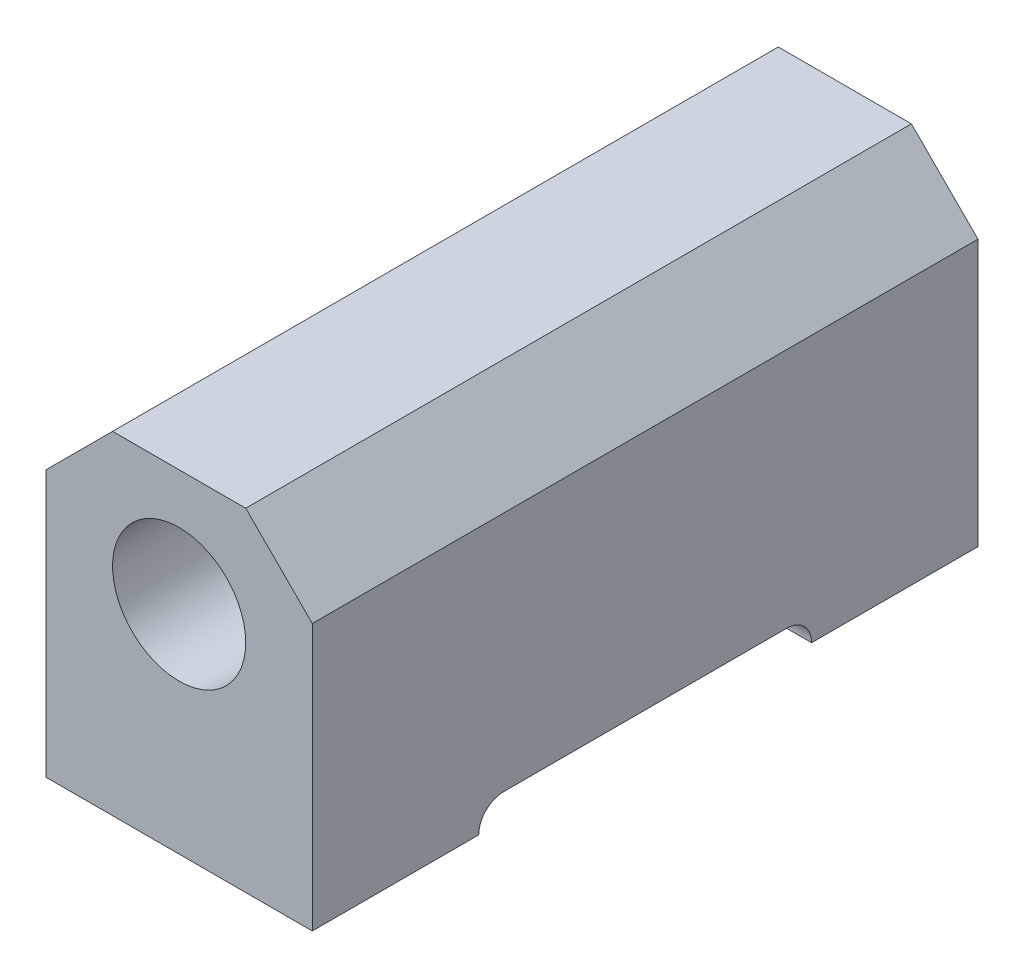
ISO-10303-21;
HEADER;
FILE_DESCRIPTION(('STEP AP214'),'2;1');
FILE_NAME('part.step','',(''),(''),'','','');
FILE_SCHEMA(('AUTOMOTIVE_DESIGN { 1 0 10303 214 1 1 1 1 }'));
ENDSEC;
DATA;
#1=APPLICATION_CONTEXT('core data for automotive mechanical design processes');
#2=APPLICATION_PROTOCOL_DEFINITION('international standard','automotive_design',2000,#1);
#3=PRODUCT_CONTEXT('',#1,'mechanical');
#4=PRODUCT('Part','Part','',(#3));
#5=PRODUCT_RELATED_PRODUCT_CATEGORY('part','',(#4));
#6=PRODUCT_DEFINITION_FORMATION('','',#4);
#7=PRODUCT_DEFINITION_CONTEXT('part definition',#1,'design');
#8=PRODUCT_DEFINITION('design','',#6,#7);
#9=PRODUCT_DEFINITION_SHAPE('','',#8);
#10=(LENGTH_UNIT() NAMED_UNIT(*) SI_UNIT(.MILLI.,.METRE.));
#11=(NAMED_UNIT(*) PLANE_ANGLE_UNIT() SI_UNIT($,.RADIAN.));
#12=(NAMED_UNIT(*) SI_UNIT($,.STERADIAN.) SOLID_ANGLE_UNIT());
#13=UNCERTAINTY_MEASURE_WITH_UNIT(LENGTH_MEASURE(1.E-05),#10,'distance_accuracy_value','');
#14=(GEOMETRIC_REPRESENTATION_CONTEXT(3) GLOBAL_UNCERTAINTY_ASSIGNED_CONTEXT((#13)) GLOBAL_UNIT_ASSIGNED_CONTEXT((#10,
#11,#12)) REPRESENTATION_CONTEXT('',''));
#15=CARTESIAN_POINT('',(0.,0.,0.));
#16=DIRECTION('',(0.,0.,1.));
#17=DIRECTION('',(1.,0.,0.));
#18=AXIS2_PLACEMENT_3D('',#15,#16,#17);
#19=CARTESIAN_POINT('',(-16.,0.,80.));
#20=DIRECTION('',(0.,1.,0.));
#21=DIRECTION('',(0.,0.,1.));
#22=AXIS2_PLACEMENT_3D('',#19,#20,#21);
#23=PLANE('',#22);
#24=DIRECTION('',(0.,0.,-1.));
#25=VECTOR('',#24,1.);
#26=CARTESIAN_POINT('',(-16.,0.,80.));
#27=LINE('',#26,#25);
#28=CARTESIAN_POINT('',(-16.,0.,80.));
#29=VERTEX_POINT('',#28);
#30=CARTESIAN_POINT('',(-16.,0.,60.));
#31=VERTEX_POINT('',#30);
#32=EDGE_CURVE('E11',#29,#31,#27,.T.);
#33=ORIENTED_EDGE('',*,*,#32,.T.);
#34=DIRECTION('',(1.,0.,0.));
#35=VECTOR('',#34,1.);
#36=CARTESIAN_POINT('',(-16.,0.,60.));
#37=LINE('',#36,#35);
#38=CARTESIAN_POINT('',(16.,0.,60.));
#39=VERTEX_POINT('',#38);
#40=EDGE_CURVE('E149',#31,#39,#37,.T.);
#41=ORIENTED_EDGE('',*,*,#40,.T.);
#42=DIRECTION('',(0.,0.,-1.));
#43=VECTOR('',#42,1.);
#44=CARTESIAN_POINT('',(16.,0.,80.));
#45=LINE('',#44,#43);
#46=CARTESIAN_POINT('',(16.,0.,80.));
#47=VERTEX_POINT('',#46);
#48=EDGE_CURVE('E196',#47,#39,#45,.T.);
#49=ORIENTED_EDGE('',*,*,#48,.F.);
#50=DIRECTION('',(1.,0.,0.));
#51=VECTOR('',#50,1.);
#52=CARTESIAN_POINT('',(-16.,0.,80.));
#53=LINE('',#52,#51);
#54=EDGE_CURVE('E161',#29,#47,#53,.T.);
#55=ORIENTED_EDGE('',*,*,#54,.F.);
#56=EDGE_LOOP('',(#33,#41,#49,#55));
#57=FACE_BOUND('',#56,.T.);
#58=ADVANCED_FACE('F35',(#57),#23,.F.);
#59=CARTESIAN_POINT('',(-16.,32.,80.));
#60=DIRECTION('',(1.,0.,0.));
#61=DIRECTION('',(0.,0.,-1.));
#62=AXIS2_PLACEMENT_3D('',#59,#60,#61);
#63=PLANE('',#62);
#64=DIRECTION('',(0.,0.,1.));
#65=VECTOR('',#64,1.);
#66=CARTESIAN_POINT('',(-16.,3.,57.));
#67=LINE('',#66,#65);
#68=CARTESIAN_POINT('',(-16.,3.,23.));
#69=VERTEX_POINT('',#68);
#70=CARTESIAN_POINT('',(-16.,3.,57.));
#71=VERTEX_POINT('',#70);
#72=EDGE_CURVE('E139',#69,#71,#67,.T.);
#73=ORIENTED_EDGE('',*,*,#72,.T.);
#74=CARTESIAN_POINT('',(-16.,0.,57.));
#75=DIRECTION('',(1.,0.,0.));
#76=DIRECTION('',(0.,0.,1.));
#77=AXIS2_PLACEMENT_3D('',#74,#75,#76);
#78=CIRCLE('',#77,3.);
#79=EDGE_CURVE('E143',#71,#31,#78,.T.);
#80=ORIENTED_EDGE('',*,*,#79,.T.);
#81=ORIENTED_EDGE('',*,*,#32,.F.);
#82=DIRECTION('',(0.,-1.,0.));
#83=VECTOR('',#82,1.);
#84=CARTESIAN_POINT('',(-16.,32.,80.));
#85=LINE('',#84,#83);
#86=CARTESIAN_POINT('',(-16.,32.,80.));
#87=VERTEX_POINT('',#86);
#88=EDGE_CURVE('E158',#87,#29,#85,.T.);
#89=ORIENTED_EDGE('',*,*,#88,.F.);
#90=DIRECTION('',(0.,0.,-1.));
#91=VECTOR('',#90,1.);
#92=CARTESIAN_POINT('',(-16.,32.,80.));
#93=LINE('',#92,#91);
#94=CARTESIAN_POINT('',(-16.,32.,0.));
#95=VERTEX_POINT('',#94);
#96=EDGE_CURVE('E172',#87,#95,#93,.T.);
#97=ORIENTED_EDGE('',*,*,#96,.T.);
#98=DIRECTION('',(0.,-1.,0.));
#99=VECTOR('',#98,1.);
#100=CARTESIAN_POINT('',(-16.,32.,0.));
#101=LINE('',#100,#99);
#102=CARTESIAN_POINT('',(-16.,0.,0.));
#103=VERTEX_POINT('',#102);
#104=EDGE_CURVE('E152',#95,#103,#101,.T.);
#105=ORIENTED_EDGE('',*,*,#104,.T.);
#106=CARTESIAN_POINT('',(-16.,0.,20.));
#107=VERTEX_POINT('',#106);
#108=EDGE_CURVE('E43',#107,#103,#27,.T.);
#109=ORIENTED_EDGE('',*,*,#108,.F.);
#110=CARTESIAN_POINT('',(-16.,0.,23.));
#111=DIRECTION('',(1.,0.,0.));
#112=DIRECTION('',(0.,0.,-1.));
#113=AXIS2_PLACEMENT_3D('',#110,#111,#112);
#114=CIRCLE('',#113,3.);
#115=EDGE_CURVE('E136',#107,#69,#114,.T.);
#116=ORIENTED_EDGE('',*,*,#115,.T.);
#117=EDGE_LOOP('',(#73,#80,#81,#89,#97,#105,#109,#116));
#118=FACE_BOUND('',#117,.T.);
#119=ADVANCED_FACE('F37',(#118),#63,.F.);
#120=CARTESIAN_POINT('',(0.,0.,10.));
#121=DIRECTION('',(0.,-1.,0.));
#122=DIRECTION('',(0.,0.,-1.));
#123=AXIS2_PLACEMENT_3D('',#120,#121,#122);
#124=CIRCLE('',#123,2.);
#125=CARTESIAN_POINT('',(0.,0.,8.));
#126=VERTEX_POINT('',#125);
#127=EDGE_CURVE('E259',#126,#126,#124,.T.);
#128=ORIENTED_EDGE('',*,*,#127,.F.);
#129=EDGE_LOOP('',(#128));
#130=FACE_BOUND('',#129,.T.);
#131=CARTESIAN_POINT('',(16.,0.,20.));
#132=VERTEX_POINT('',#131);
#133=CARTESIAN_POINT('',(16.,0.,0.));
#134=VERTEX_POINT('',#133);
#135=EDGE_CURVE('E195',#132,#134,#45,.T.);
#136=ORIENTED_EDGE('',*,*,#135,.F.);
#137=DIRECTION('',(1.,0.,0.));
#138=VECTOR('',#137,1.);
#139=CARTESIAN_POINT('',(-16.,0.,20.));
#140=LINE('',#139,#138);
#141=EDGE_CURVE('E55',#107,#132,#140,.T.);
#142=ORIENTED_EDGE('',*,*,#141,.F.);
#143=ORIENTED_EDGE('',*,*,#108,.T.);
#144=DIRECTION('',(1.,0.,0.));
#145=VECTOR('',#144,1.);
#146=CARTESIAN_POINT('',(-16.,0.,0.));
#147=LINE('',#146,#145);
#148=EDGE_CURVE('E175',#103,#134,#147,.T.);
#149=ORIENTED_EDGE('',*,*,#148,.T.);
#150=EDGE_LOOP('',(#136,#142,#143,#149));
#151=FACE_BOUND('',#150,.T.);
#152=ADVANCED_FACE('F209',(#130,#151),#23,.F.);
#153=CARTESIAN_POINT('',(16.,0.,80.));
#154=DIRECTION('',(-1.,0.,0.));
#155=DIRECTION('',(0.,0.,1.));
#156=AXIS2_PLACEMENT_3D('',#153,#154,#155);
#157=PLANE('',#156);
#158=ORIENTED_EDGE('',*,*,#48,.T.);
#159=CARTESIAN_POINT('',(16.,0.,57.));
#160=DIRECTION('',(1.,0.,0.));
#161=DIRECTION('',(0.,0.,1.));
#162=AXIS2_PLACEMENT_3D('',#159,#160,#161);
#163=CIRCLE('',#162,3.);
#164=CARTESIAN_POINT('',(16.,3.,57.));
#165=VERTEX_POINT('',#164);
#166=EDGE_CURVE('E140',#165,#39,#163,.T.);
#167=ORIENTED_EDGE('',*,*,#166,.F.);
#168=DIRECTION('',(0.,0.,1.));
#169=VECTOR('',#168,1.);
#170=CARTESIAN_POINT('',(16.,3.,57.));
#171=LINE('',#170,#169);
#172=CARTESIAN_POINT('',(16.,3.,23.));
#173=VERTEX_POINT('',#172);
#174=EDGE_CURVE('E129',#173,#165,#171,.T.);
#175=ORIENTED_EDGE('',*,*,#174,.F.);
#176=CARTESIAN_POINT('',(16.,0.,23.));
#177=DIRECTION('',(1.,0.,0.));
#178=DIRECTION('',(0.,0.,-1.));
#179=AXIS2_PLACEMENT_3D('',#176,#177,#178);
#180=CIRCLE('',#179,3.);
#181=EDGE_CURVE('E126',#132,#173,#180,.T.);
#182=ORIENTED_EDGE('',*,*,#181,.F.);
#183=ORIENTED_EDGE('',*,*,#135,.T.);
#184=DIRECTION('',(0.,1.,0.));
#185=VECTOR('',#184,1.);
#186=CARTESIAN_POINT('',(16.,0.,0.));
#187=LINE('',#186,#185);
#188=CARTESIAN_POINT('',(16.,32.,0.));
#189=VERTEX_POINT('',#188);
#190=EDGE_CURVE('E178',#134,#189,#187,.T.);
#191=ORIENTED_EDGE('',*,*,#190,.T.);
#192=DIRECTION('',(0.,0.,-1.));
#193=VECTOR('',#192,1.);
#194=CARTESIAN_POINT('',(16.,32.,80.));
#195=LINE('',#194,#193);
#196=CARTESIAN_POINT('',(16.,32.,80.));
#197=VERTEX_POINT('',#196);
#198=EDGE_CURVE('E193',#197,#189,#195,.T.);
#199=ORIENTED_EDGE('',*,*,#198,.F.);
#200=DIRECTION('',(0.,1.,0.));
#201=VECTOR('',#200,1.);
#202=CARTESIAN_POINT('',(16.,0.,80.));
#203=LINE('',#202,#201);
#204=EDGE_CURVE('E164',#47,#197,#203,.T.);
#205=ORIENTED_EDGE('',*,*,#204,.F.);
#206=EDGE_LOOP('',(#158,#167,#175,#182,#183,#191,#199,#205));
#207=FACE_BOUND('',#206,.T.);
#208=ADVANCED_FACE('F203',(#207),#157,.F.);
#209=CARTESIAN_POINT('',(16.,32.,80.));
#210=DIRECTION('',(-0.707106781186549,-0.707106781186546,0.));
#211=DIRECTION('',(0.707106781186546,-0.707106781186549,0.));
#212=AXIS2_PLACEMENT_3D('',#209,#210,#211);
#213=PLANE('',#212);
#214=DIRECTION('',(-0.707106781186546,0.707106781186549,0.));
#215=VECTOR('',#214,1.);
#216=CARTESIAN_POINT('',(16.,32.,0.));
#217=LINE('',#216,#215);
#218=CARTESIAN_POINT('',(8.00000000000003,40.,0.));
#219=VERTEX_POINT('',#218);
#220=EDGE_CURVE('E180',#189,#219,#217,.T.);
#221=ORIENTED_EDGE('',*,*,#220,.T.);
#222=DIRECTION('',(0.,0.,-1.));
#223=VECTOR('',#222,1.);
#224=CARTESIAN_POINT('',(8.00000000000003,40.,80.));
#225=LINE('',#224,#223);
#226=CARTESIAN_POINT('',(8.00000000000003,40.,80.));
#227=VERTEX_POINT('',#226);
#228=EDGE_CURVE('E190',#227,#219,#225,.T.);
#229=ORIENTED_EDGE('',*,*,#228,.F.);
#230=DIRECTION('',(-0.707106781186546,0.707106781186549,0.));
#231=VECTOR('',#230,1.);
#232=CARTESIAN_POINT('',(16.,32.,80.));
#233=LINE('',#232,#231);
#234=EDGE_CURVE('E166',#197,#227,#233,.T.);
#235=ORIENTED_EDGE('',*,*,#234,.F.);
#236=ORIENTED_EDGE('',*,*,#198,.T.);
#237=EDGE_LOOP('',(#221,#229,#235,#236));
#238=FACE_BOUND('',#237,.T.);
#239=ADVANCED_FACE('F219',(#238),#213,.F.);
#240=CARTESIAN_POINT('',(8.00000000000003,40.,80.));
#241=DIRECTION('',(0.,-1.,0.));
#242=DIRECTION('',(0.,0.,-1.));
#243=AXIS2_PLACEMENT_3D('',#240,#241,#242);
#244=PLANE('',#243);
#245=DIRECTION('',(-1.,0.,0.));
#246=VECTOR('',#245,1.);
#247=CARTESIAN_POINT('',(8.00000000000003,40.,0.));
#248=LINE('',#247,#246);
#249=CARTESIAN_POINT('',(-7.99999999999997,40.,0.));
#250=VERTEX_POINT('',#249);
#251=EDGE_CURVE('E182',#219,#250,#248,.T.);
#252=ORIENTED_EDGE('',*,*,#251,.T.);
#253=DIRECTION('',(0.,0.,-1.));
#254=VECTOR('',#253,1.);
#255=CARTESIAN_POINT('',(-7.99999999999997,40.,80.));
#256=LINE('',#255,#254);
#257=CARTESIAN_POINT('',(-7.99999999999997,40.,80.));
#258=VERTEX_POINT('',#257);
#259=EDGE_CURVE('E187',#258,#250,#256,.T.);
#260=ORIENTED_EDGE('',*,*,#259,.F.);
#261=DIRECTION('',(-1.,0.,0.));
#262=VECTOR('',#261,1.);
#263=CARTESIAN_POINT('',(8.00000000000003,40.,80.));
#264=LINE('',#263,#262);
#265=EDGE_CURVE('E168',#227,#258,#264,.T.);
#266=ORIENTED_EDGE('',*,*,#265,.F.);
#267=ORIENTED_EDGE('',*,*,#228,.T.);
#268=EDGE_LOOP('',(#252,#260,#266,#267));
#269=FACE_BOUND('',#268,.T.);
#270=ADVANCED_FACE('F223',(#269),#244,.F.);
#271=CARTESIAN_POINT('',(-7.99999999999997,40.,80.));
#272=DIRECTION('',(0.707106781186546,-0.707106781186549,0.));
#273=DIRECTION('',(0.707106781186549,0.707106781186546,0.));
#274=AXIS2_PLACEMENT_3D('',#271,#272,#273);
#275=PLANE('',#274);
#276=DIRECTION('',(-0.707106781186549,-0.707106781186546,0.));
#277=VECTOR('',#276,1.);
#278=CARTESIAN_POINT('',(-7.99999999999997,40.,0.));
#279=LINE('',#278,#277);
#280=EDGE_CURVE('E162',#250,#95,#279,.T.);
#281=ORIENTED_EDGE('',*,*,#280,.T.);
#282=ORIENTED_EDGE('',*,*,#96,.F.);
#283=DIRECTION('',(-0.707106781186549,-0.707106781186546,0.));
#284=VECTOR('',#283,1.);
#285=CARTESIAN_POINT('',(-7.99999999999997,40.,80.));
#286=LINE('',#285,#284);
#287=EDGE_CURVE('E170',#258,#87,#286,.T.);
#288=ORIENTED_EDGE('',*,*,#287,.F.);
#289=ORIENTED_EDGE('',*,*,#259,.T.);
#290=EDGE_LOOP('',(#281,#282,#288,#289));
#291=FACE_BOUND('',#290,.T.);
#292=ADVANCED_FACE('F298',(#291),#275,.F.);
#293=CARTESIAN_POINT('',(-16.,0.,80.));
#294=DIRECTION('',(0.,0.,1.));
#295=DIRECTION('',(1.,0.,0.));
#296=AXIS2_PLACEMENT_3D('',#293,#294,#295);
#297=PLANE('',#296);
#298=CARTESIAN_POINT('',(0.,26.,80.));
#299=DIRECTION('',(0.,0.,1.));
#300=DIRECTION('',(1.,0.,0.));
#301=AXIS2_PLACEMENT_3D('',#298,#299,#300);
#302=CIRCLE('',#301,8.);
#303=CARTESIAN_POINT('',(8.,26.,80.));
#304=VERTEX_POINT('',#303);
#305=EDGE_CURVE('E127',#304,#304,#302,.T.);
#306=ORIENTED_EDGE('',*,*,#305,.F.);
#307=EDGE_LOOP('',(#306));
#308=FACE_BOUND('',#307,.T.);
#309=ORIENTED_EDGE('',*,*,#88,.T.);
#310=ORIENTED_EDGE('',*,*,#54,.T.);
#311=ORIENTED_EDGE('',*,*,#204,.T.);
#312=ORIENTED_EDGE('',*,*,#234,.T.);
#313=ORIENTED_EDGE('',*,*,#265,.T.);
#314=ORIENTED_EDGE('',*,*,#287,.T.);
#315=EDGE_LOOP('',(#309,#310,#311,#312,#313,#314));
#316=FACE_BOUND('',#315,.T.);
#317=ADVANCED_FACE('F227',(#308,#316),#297,.T.);
#318=CARTESIAN_POINT('',(-16.,0.,0.));
#319=DIRECTION('',(0.,0.,1.));
#320=DIRECTION('',(1.,0.,0.));
#321=AXIS2_PLACEMENT_3D('',#318,#319,#320);
#322=PLANE('',#321);
#323=ORIENTED_EDGE('',*,*,#104,.F.);
#324=ORIENTED_EDGE('',*,*,#280,.F.);
#325=ORIENTED_EDGE('',*,*,#251,.F.);
#326=ORIENTED_EDGE('',*,*,#220,.F.);
#327=ORIENTED_EDGE('',*,*,#190,.F.);
#328=ORIENTED_EDGE('',*,*,#148,.F.);
#329=EDGE_LOOP('',(#323,#324,#325,#326,#327,#328));
#330=FACE_BOUND('',#329,.T.);
#331=ADVANCED_FACE('F214',(#330),#322,.F.);
#332=CARTESIAN_POINT('',(-16.,0.,57.));
#333=DIRECTION('',(1.,0.,0.));
#334=DIRECTION('',(0.,0.,-1.));
#335=AXIS2_PLACEMENT_3D('',#332,#333,#334);
#336=CYLINDRICAL_SURFACE('',#335,3.);
#337=ORIENTED_EDGE('',*,*,#166,.T.);
#338=ORIENTED_EDGE('',*,*,#40,.F.);
#339=ORIENTED_EDGE('',*,*,#79,.F.);
#340=DIRECTION('',(1.,0.,0.));
#341=VECTOR('',#340,1.);
#342=CARTESIAN_POINT('',(-16.,3.,57.));
#343=LINE('',#342,#341);
#344=EDGE_CURVE('E153',#71,#165,#343,.T.);
#345=ORIENTED_EDGE('',*,*,#344,.T.);
#346=EDGE_LOOP('',(#337,#338,#339,#345));
#347=FACE_BOUND('',#346,.T.);
#348=ADVANCED_FACE('F234',(#347),#336,.F.);
#349=CARTESIAN_POINT('',(-16.,3.,57.));
#350=DIRECTION('',(0.,1.,0.));
#351=DIRECTION('',(0.,0.,1.));
#352=AXIS2_PLACEMENT_3D('',#349,#350,#351);
#353=PLANE('',#352);
#354=CARTESIAN_POINT('',(0.,3.,40.));
#355=DIRECTION('',(0.,-1.,0.));
#356=DIRECTION('',(0.,0.,-1.));
#357=AXIS2_PLACEMENT_3D('',#354,#355,#356);
#358=CIRCLE('',#357,5.);
#359=CARTESIAN_POINT('',(0.,3.,35.));
#360=VERTEX_POINT('',#359);
#361=EDGE_CURVE('E132',#360,#360,#358,.T.);
#362=ORIENTED_EDGE('',*,*,#361,.F.);
#363=EDGE_LOOP('',(#362));
#364=FACE_BOUND('',#363,.T.);
#365=ORIENTED_EDGE('',*,*,#174,.T.);
#366=ORIENTED_EDGE('',*,*,#344,.F.);
#367=ORIENTED_EDGE('',*,*,#72,.F.);
#368=DIRECTION('',(1.,0.,0.));
#369=VECTOR('',#368,1.);
#370=CARTESIAN_POINT('',(-16.,3.,23.));
#371=LINE('',#370,#369);
#372=EDGE_CURVE('E155',#69,#173,#371,.T.);
#373=ORIENTED_EDGE('',*,*,#372,.T.);
#374=EDGE_LOOP('',(#365,#366,#367,#373));
#375=FACE_BOUND('',#374,.T.);
#376=ADVANCED_FACE('F238',(#364,#375),#353,.F.);
#377=CARTESIAN_POINT('',(-16.,0.,23.));
#378=DIRECTION('',(1.,0.,0.));
#379=DIRECTION('',(0.,0.,-1.));
#380=AXIS2_PLACEMENT_3D('',#377,#378,#379);
#381=CYLINDRICAL_SURFACE('',#380,3.);
#382=ORIENTED_EDGE('',*,*,#181,.T.);
#383=ORIENTED_EDGE('',*,*,#372,.F.);
#384=ORIENTED_EDGE('',*,*,#115,.F.);
#385=ORIENTED_EDGE('',*,*,#141,.T.);
#386=EDGE_LOOP('',(#382,#383,#384,#385));
#387=FACE_BOUND('',#386,.T.);
#388=ADVANCED_FACE('F120',(#387),#381,.F.);
#389=CARTESIAN_POINT('',(0.,26.,7.99999999999999));
#390=DIRECTION('',(0.,0.,1.));
#391=DIRECTION('',(1.,0.,0.));
#392=AXIS2_PLACEMENT_3D('',#389,#390,#391);
#393=CONICAL_SURFACE('',#392,7.99999999999999,1.0471975511966);
#394=CARTESIAN_POINT('',(0.,26.,3.38119784648298));
#395=VERTEX_POINT('',#394);
#396=VERTEX_LOOP('',#395);
#397=FACE_BOUND('',#396,.T.);
#398=CARTESIAN_POINT('',(0.,26.,7.99999999999999));
#399=DIRECTION('',(0.,0.,1.));
#400=DIRECTION('',(1.,0.,0.));
#401=AXIS2_PLACEMENT_3D('',#398,#399,#400);
#402=CIRCLE('',#401,7.99999999999999);
#403=CARTESIAN_POINT('',(0.,18.,7.99999999999999));
#404=VERTEX_POINT('',#403);
#405=EDGE_CURVE('E124',#404,#404,#402,.T.);
#406=ORIENTED_EDGE('',*,*,#405,.T.);
#407=EDGE_LOOP('',(#406));
#408=FACE_BOUND('',#407,.T.);
#409=ADVANCED_FACE('F116',(#397,#408),#393,.F.);
#410=CARTESIAN_POINT('',(0.,26.,80.));
#411=DIRECTION('',(0.,0.,1.));
#412=DIRECTION('',(1.,0.,0.));
#413=AXIS2_PLACEMENT_3D('',#410,#411,#412);
#414=CYLINDRICAL_SURFACE('',#413,7.99999999999999);
#415=CARTESIAN_POINT('',(0.,18.,35.));
#416=CARTESIAN_POINT('',(-0.127079718194144,18.0000003006796,35.000000296842));
#417=CARTESIAN_POINT('',(-0.254165976353162,18.0030347356193,35.0048512283096));
#418=CARTESIAN_POINT('',(-0.507365681398697,18.0150983665483,35.0241874569837));
#419=CARTESIAN_POINT('',(-0.633478681463028,18.0241301674796,35.0386769406781));
#420=CARTESIAN_POINT('',(-0.883879235580956,18.0479815534638,35.0771121652382));
#421=CARTESIAN_POINT('',(-1.00816396386935,18.0628092844035,35.101071215632));
#422=CARTESIAN_POINT('',(-1.25388007858571,18.0978991671513,35.1581302156745));
#423=CARTESIAN_POINT('',(-1.3753102342372,18.1181636179522,35.1912340324912));
#424=CARTESIAN_POINT('',(-1.61383677448202,18.1635349266236,35.2659676012994));
#425=CARTESIAN_POINT('',(-1.73095311667823,18.1886148833552,35.3075500649484));
#426=CARTESIAN_POINT('',(-1.96091650164603,18.2431450510125,35.3988984752484));
#427=CARTESIAN_POINT('',(-2.07376186971092,18.2725969544074,35.448667591929));
#428=CARTESIAN_POINT('',(-2.40491190911409,18.3665929175856,35.6094966420057));
#429=CARTESIAN_POINT('',(-2.61609848167961,18.4368302651889,35.7321634502412));
#430=CARTESIAN_POINT('',(-3.03193014433838,18.5931970429278,36.0155539530375));
#431=CARTESIAN_POINT('',(-3.23470598963289,18.6801476647168,36.178534536555));
#432=CARTESIAN_POINT('',(-3.61195776992338,18.8587598707357,36.5328993916964));
#433=CARTESIAN_POINT('',(-3.78639500697958,18.9504276754588,36.7243218309789));
#434=CARTESIAN_POINT('',(-4.03551059577151,19.0916378287898,37.0442857497901));
#435=CARTESIAN_POINT('',(-4.12074022592498,19.1422779592418,37.1642871309724));
#436=CARTESIAN_POINT('',(-4.28074637131475,19.241003531769,37.4121510363447));
#437=CARTESIAN_POINT('',(-4.35552092872511,19.289088494319,37.5400150264565));
#438=CARTESIAN_POINT('',(-4.49385262588457,19.3809232204305,37.802884187676));
#439=CARTESIAN_POINT('',(-4.55742717693474,19.4246796657358,37.9378778427623));
#440=CARTESIAN_POINT('',(-4.67278116226383,19.5061484394316,38.2146224476971));
#441=CARTESIAN_POINT('',(-4.72456056034896,19.5438607492754,38.3563734182791));
#442=CARTESIAN_POINT('',(-4.80367778250345,19.6026226043952,38.6081335829205));
#443=CARTESIAN_POINT('',(-4.83387146386473,19.6254567081187,38.7168360544119));
#444=CARTESIAN_POINT('',(-4.8869893698177,19.6660868688677,38.9369191468738));
#445=CARTESIAN_POINT('',(-4.90991524122178,19.6838840671069,39.0482991549792));
#446=CARTESIAN_POINT('',(-4.94817199977536,19.7138099556455,39.2729763383395));
#447=CARTESIAN_POINT('',(-4.96351189515874,19.7259453682573,39.3862710736682));
#448=CARTESIAN_POINT('',(-4.98640391146144,19.7441234488999,39.6141412908148));
#449=CARTESIAN_POINT('',(-4.99395573327638,19.750165882927,39.7287168216515));
#450=CARTESIAN_POINT('',(-5.00115324292108,19.755923738087,39.9585586538154));
#451=CARTESIAN_POINT('',(-5.00077951510321,19.755623621537,40.0738259597954));
#452=CARTESIAN_POINT('',(-4.99208386707443,19.7486698583127,40.3039059935161));
#453=CARTESIAN_POINT('',(-4.9837590327066,19.7420138821551,40.4187185390899));
#454=CARTESIAN_POINT('',(-4.95928874246479,19.7226041555614,40.6470210819789));
#455=CARTESIAN_POINT('',(-4.94314081984502,19.7098484818089,40.7605106505716));
#456=CARTESIAN_POINT('',(-4.90327193771259,19.6787219477735,40.9853862031786));
#457=CARTESIAN_POINT('',(-4.87954784440757,19.6603487640089,41.0967712964728));
#458=CARTESIAN_POINT('',(-4.79874186577055,19.5987006593766,41.4216199842904));
#459=CARTESIAN_POINT('',(-4.73140686716691,19.5483729067626,41.6312924778487));
#460=CARTESIAN_POINT('',(-4.57160139234777,19.434175834222,42.0366820884598));
#461=CARTESIAN_POINT('',(-4.47912202607653,19.3703017265995,42.2323942387335));
#462=CARTESIAN_POINT('',(-4.25180409904385,19.2218102719316,42.6433146532492));
#463=CARTESIAN_POINT('',(-4.1122797851601,19.1355469473017,42.8553352022809));
#464=CARTESIAN_POINT('',(-3.80349790123425,18.959760909828,43.2553491837402));
#465=CARTESIAN_POINT('',(-3.6342097710279,18.8702349226524,43.443317574402));
#466=CARTESIAN_POINT('',(-3.34462792787134,18.731747790724,43.7195685480643));
#467=CARTESIAN_POINT('',(-3.23332743959704,18.6814337178757,43.8167428012039));
#468=CARTESIAN_POINT('',(-3.00184758289935,18.5834859479388,44.0013511127846));
#469=CARTESIAN_POINT('',(-2.88167150233175,18.535851269706,44.0887887482357));
#470=CARTESIAN_POINT('',(-2.63291547069676,18.4445172241313,44.2532332200851));
#471=CARTESIAN_POINT('',(-2.50433330649267,18.400818900404,44.3302372930273));
#472=CARTESIAN_POINT('',(-2.2395394350338,18.3186159454287,44.4729252881308));
#473=CARTESIAN_POINT('',(-2.10333250541062,18.2801081122825,44.5386161961416));
#474=CARTESIAN_POINT('',(-1.83158498937009,18.2112980286651,44.6546688647531));
#475=CARTESIAN_POINT('',(-1.6963979201899,18.1806672019347,44.7056622977745));
#476=CARTESIAN_POINT('',(-1.42097512774064,18.1259588684241,44.796020989619));
#477=CARTESIAN_POINT('',(-1.28074233969553,18.1018776192048,44.8353928901058));
#478=CARTESIAN_POINT('',(-0.996484502868531,18.0610065472061,44.9018673984066));
#479=CARTESIAN_POINT('',(-0.852462989802597,18.0442101653559,44.9289810441132));
#480=CARTESIAN_POINT('',(-0.561915361707673,18.0184270075249,44.970490349973));
#481=CARTESIAN_POINT('',(-0.415389678880749,18.0094388974979,44.9848881826348));
#482=CARTESIAN_POINT('',(-0.143238039189046,18.0003013297406,44.999520164093));
#483=CARTESIAN_POINT('',(-0.0177414078568212,17.9990370730211,45.001540864089));
#484=CARTESIAN_POINT('',(0.232966367766388,18.002410548174,44.9961427784958));
#485=CARTESIAN_POINT('',(0.358177530272747,18.0070478922784,44.9887246130925));
#486=CARTESIAN_POINT('',(0.607327834496602,18.0221099447875,44.9645562224732));
#487=CARTESIAN_POINT('',(0.731267089300064,18.0325341340599,44.9478068343515));
#488=CARTESIAN_POINT('',(0.976969695221634,18.0589169978586,44.9052093073227));
#489=CARTESIAN_POINT('',(1.09873300792334,18.074875769997,44.87936100794));
#490=CARTESIAN_POINT('',(1.33450834578851,18.1112265535098,44.8200905528087));
#491=CARTESIAN_POINT('',(1.44863666980923,18.1314188710152,44.7870073558854));
#492=CARTESIAN_POINT('',(1.67350231741756,18.1761546703508,44.7131109673576));
#493=CARTESIAN_POINT('',(1.78423846943477,18.2006996360411,44.6722951392984));
#494=CARTESIAN_POINT('',(2.11043845304157,18.2801548047841,44.5388502230673));
#495=CARTESIAN_POINT('',(2.32007565393524,18.3409144286362,44.4351772881206));
#496=CARTESIAN_POINT('',(2.74037159603303,18.480405007543,44.1899279363721));
#497=CARTESIAN_POINT('',(2.94899750641244,18.5603309127279,44.0455818634156));
#498=CARTESIAN_POINT('',(3.34056091506498,18.7277196928324,43.7288284033328));
#499=CARTESIAN_POINT('',(3.5234694504051,18.8151908892655,43.5563898426156));
#500=CARTESIAN_POINT('',(3.88590040481162,19.0037658043038,43.1594550330802));
#501=CARTESIAN_POINT('',(4.06107692783135,19.1050052304157,42.9310356086568));
#502=CARTESIAN_POINT('',(4.37121122716532,19.2973289234528,42.4445124155777));
#503=CARTESIAN_POINT('',(4.50619684735976,19.3884201934169,42.186429370211));
#504=CARTESIAN_POINT('',(4.70739703071134,19.5306601102679,41.7011860423082));
#505=CARTESIAN_POINT('',(4.78209607779641,19.5861789350792,41.478884271898));
#506=CARTESIAN_POINT('',(4.87056932795047,19.6534340325645,41.1364345116806));
#507=CARTESIAN_POINT('',(4.89612834571372,19.6731794509136,41.0208098766569));
#508=CARTESIAN_POINT('',(4.93906627660446,19.7066404099646,40.787213009902));
#509=CARTESIAN_POINT('',(4.95644870968554,19.720358545195,40.6692418111866));
#510=CARTESIAN_POINT('',(4.98283345322303,19.7412735343223,40.4310629765311));
#511=CARTESIAN_POINT('',(4.99178464992502,19.7484306053433,40.3108461491944));
#512=CARTESIAN_POINT('',(5.00096567028373,19.7557724594224,40.0698650772981));
#513=CARTESIAN_POINT('',(5.00119553239925,19.7559572732264,39.9491008351548));
#514=CARTESIAN_POINT('',(4.99292458618068,19.7493413275229,39.7080244741889));
#515=CARTESIAN_POINT('',(4.98442112542227,19.7425384457609,39.5877125038687));
#516=CARTESIAN_POINT('',(4.95884706925013,19.7222544312381,39.3486063370178));
#517=CARTESIAN_POINT('',(4.94177659470706,19.7087733926983,39.2298121190975));
#518=CARTESIAN_POINT('',(4.88153513763474,19.6617722601974,38.8960286100219));
#519=CARTESIAN_POINT('',(4.82847742875036,19.6209242355378,38.6837622399749));
#520=CARTESIAN_POINT('',(4.69670428935884,19.5233022299588,38.271420298846));
#521=CARTESIAN_POINT('',(4.61797815957075,19.4665216092875,38.0713498526985));
#522=CARTESIAN_POINT('',(4.42410573147436,19.333442068667,37.657624436927));
#523=CARTESIAN_POINT('',(4.30533683658204,19.2555075085708,37.4461960440315));
#524=CARTESIAN_POINT('',(4.04000963034607,19.0932950176486,37.0442492953191));
#525=CARTESIAN_POINT('',(3.89342885237778,19.009011991913,36.8537480423982));
#526=CARTESIAN_POINT('',(3.54264024371939,18.823910052174,36.4599160307928));
#527=CARTESIAN_POINT('',(3.33276887019886,18.7231235963555,36.2615221099095));
#528=CARTESIAN_POINT('',(2.99268031590094,18.579816409537,35.9918997698398));
#529=CARTESIAN_POINT('',(2.87498419390476,18.5333203747759,35.9066216817465));
#530=CARTESIAN_POINT('',(2.63162062416605,18.4441198094528,35.7460851399745));
#531=CARTESIAN_POINT('',(2.50595739502896,18.4014133006027,35.6708214479967));
#532=CARTESIAN_POINT('',(2.24695585117554,18.3208311110942,35.5308937294737));
#533=CARTESIAN_POINT('',(2.11359966396134,18.2829673959028,35.4662558487738));
#534=CARTESIAN_POINT('',(1.84039127350631,18.2132925493396,35.3486499392036));
#535=CARTESIAN_POINT('',(1.70054287903653,18.181477923621,35.2956751701522));
#536=CARTESIAN_POINT('',(1.415749691869,18.1249335521176,35.2022871126872));
#537=CARTESIAN_POINT('',(1.27081981592252,18.1001847473633,35.1618400072928));
#538=CARTESIAN_POINT('',(0.976912453464889,18.0584864042064,35.0940489671412));
#539=CARTESIAN_POINT('',(0.827938038321421,18.0415311137782,35.0666953680648));
#540=CARTESIAN_POINT('',(0.565708034628117,18.0192339422711,35.0308184989681));
#541=CARTESIAN_POINT('',(0.453012043961134,18.0120345778219,35.0192744959983));
#542=CARTESIAN_POINT('',(0.226879136348955,18.0024173245057,35.0038648763943));
#543=CARTESIAN_POINT('',(0.11344217398009,17.9999997315878,34.9999997350136));
#544=CARTESIAN_POINT('',(0.,18.,35.));
#545=B_SPLINE_CURVE_WITH_KNOTS('',3,(#415,#416,#417,#418,#419,#420,#421,#422,#423,#424,#425,
#426,#427,#428,#429,#430,#431,#432,#433,#434,#435,#436,#437,#438,#439,#440,#441,#442,#443,#444,
#445,#446,#447,#448,#449,#450,#451,#452,#453,#454,#455,#456,#457,#458,#459,#460,#461,#462,#463,
#464,#465,#466,#467,#468,#469,#470,#471,#472,#473,#474,#475,#476,#477,#478,#479,#480,#481,#482,
#483,#484,#485,#486,#487,#488,#489,#490,#491,#492,#493,#494,#495,#496,#497,#498,#499,#500,#501,
#502,#503,#504,#505,#506,#507,#508,#509,#510,#511,#512,#513,#514,#515,#516,#517,#518,#519,#520,
#521,#522,#523,#524,#525,#526,#527,#528,#529,#530,#531,#532,#533,#534,#535,#536,#537,#538,#539,
#540,#541,#542,#543,#544),.UNSPECIFIED.,.T.,.F.,(4,2,2,2,2,2,2,2,2,2,2,2,2,2,2,2,2,2,2,2,2,2,2,
2,2,2,2,2,2,2,2,2,2,2,2,2,2,2,2,2,2,2,2,2,2,2,2,2,2,2,2,2,2,2,2,2,2,2,2,2,2,2,2,2,4),(0.,
0.38112281387823,0.762411275945245,1.14423755771084,1.52622555522555,1.90613865065076,
2.28619920353459,3.04547146930923,3.86537873527685,4.68639638614618,5.15288943324734,
5.61946971957746,6.08531814323783,6.55116799634915,6.89615022205284,7.24105422230074,
7.58554766475415,7.9300543371358,8.27540506342304,8.62088241265912,8.96646876744118,
9.31219825544431,9.98712845371037,10.6622975916544,11.463592889512,12.2657157783383,
12.7334704505957,13.2010527095967,13.6687585723721,14.1361745843372,14.5786070973028,
15.0207862699487,15.4625664873666,15.9042712116064,16.280349331717,16.6564027426817,
17.0324224237136,17.4084487368524,17.7696430642803,18.1309607639224,18.8530325398091,
19.6479898222925,20.4438353357779,21.3552089372189,22.2659496705468,22.9857781952855,
23.3455439181714,23.705154622762,24.0669316687913,24.4287071194786,24.7905924786018,
25.1524727320855,25.8172983911074,26.482401522191,27.2437925511324,28.005801275804,
28.9187931910577,29.3761295657642,29.8332257699804,30.2914303932663,30.7493695182481,
31.2060614935588,31.6624158626753,32.0026174741983,32.3428401405226),.UNSPECIFIED.);
#546=CARTESIAN_POINT('',(0.,18.,35.));
#547=VERTEX_POINT('',#546);
#548=EDGE_CURVE('E261',#547,#547,#545,.T.);
#549=ORIENTED_EDGE('',*,*,#548,.F.);
#550=EDGE_LOOP('',(#549));
#551=FACE_BOUND('',#550,.T.);
#552=ORIENTED_EDGE('',*,*,#405,.F.);
#553=CARTESIAN_POINT('',(0.,18.,8.));
#554=CARTESIAN_POINT('',(-0.110501451559641,18.0000018684265,8.00000310098421));
#555=CARTESIAN_POINT('',(-0.221037543774351,18.0023122915757,8.00918873436505));
#556=CARTESIAN_POINT('',(-0.438941765027377,18.0113051489347,8.04563353507601));
#557=CARTESIAN_POINT('',(-0.546308062494319,18.017990061067,8.07290294605047));
#558=CARTESIAN_POINT('',(-0.754694496243435,18.0349916489062,8.14458567128278));
#559=CARTESIAN_POINT('',(-0.855722084573335,18.0453039621059,8.18897839828703));
#560=CARTESIAN_POINT('',(-1.04889617587257,18.0684620825651,8.29357518672646));
#561=CARTESIAN_POINT('',(-1.14104237913168,18.0813079752779,8.35377978149196));
#562=CARTESIAN_POINT('',(-1.31573590306789,18.1084344854441,8.48960105287224));
#563=CARTESIAN_POINT('',(-1.39807425341474,18.122737238025,8.56548209994541));
#564=CARTESIAN_POINT('',(-1.54899856960442,18.1510183984275,8.72993627321205));
#565=CARTESIAN_POINT('',(-1.61758298259892,18.1649967694684,8.81851083059592));
#566=CARTESIAN_POINT('',(-1.74003539039863,18.1912696573578,9.00746030231599));
#567=CARTESIAN_POINT('',(-1.79366962123352,18.2035360738025,9.10799097441164));
#568=CARTESIAN_POINT('',(-1.88319587806766,18.2246734024265,9.31699788221338));
#569=CARTESIAN_POINT('',(-1.91909074058685,18.2335448574078,9.42547284444269));
#570=CARTESIAN_POINT('',(-1.97140644907302,18.2466603107157,9.64499133093555));
#571=CARTESIAN_POINT('',(-1.98820302444274,18.2509934533732,9.75593986138399));
#572=CARTESIAN_POINT('',(-2.00301570008854,18.2548085005388,9.97915809199913));
#573=CARTESIAN_POINT('',(-2.00103485575748,18.2542911942943,10.0914275742562));
#574=CARTESIAN_POINT('',(-1.97864869951961,18.2485439264424,10.3112210769938));
#575=CARTESIAN_POINT('',(-1.95869112025418,18.2434284932361,10.4187941619538));
#576=CARTESIAN_POINT('',(-1.90163224920399,18.2292438710524,10.6290147345481));
#577=CARTESIAN_POINT('',(-1.86452973609252,18.2201744004102,10.7316618707052));
#578=CARTESIAN_POINT('',(-1.77385263724958,18.1989984812579,10.9303173550028));
#579=CARTESIAN_POINT('',(-1.72011555631056,18.1868623004025,11.0262482290528));
#580=CARTESIAN_POINT('',(-1.59780836801993,18.1609371887201,11.2078916130091));
#581=CARTESIAN_POINT('',(-1.52923566507845,18.1471479688716,11.2936023307563));
#582=CARTESIAN_POINT('',(-1.37688456624163,18.1189882594681,11.4549381542592));
#583=CARTESIAN_POINT('',(-1.29272834422115,18.10461240696,11.5302059867485));
#584=CARTESIAN_POINT('',(-1.11281589000493,18.0772537922833,11.6656283232852));
#585=CARTESIAN_POINT('',(-1.01705930361059,18.0642710726746,11.7257823656848));
#586=CARTESIAN_POINT('',(-0.816154518241856,18.0410969054108,11.8294007816325));
#587=CARTESIAN_POINT('',(-0.710975190944832,18.030915198297,11.8728071203392));
#588=CARTESIAN_POINT('',(-0.494501344190511,18.0145611067811,11.9412230742794));
#589=CARTESIAN_POINT('',(-0.383207998867313,18.0083879554763,11.9662362085575));
#590=CARTESIAN_POINT('',(-0.160719960520036,18.000860009715,11.9966100874118));
#591=CARTESIAN_POINT('',(-0.0495956266509463,17.999385953223,12.0024573681004));
#592=CARTESIAN_POINT('',(0.172043833068677,18.001082602474,11.9956679972594));
#593=CARTESIAN_POINT('',(0.28255901285946,18.0042528901087,11.9830330096012));
#594=CARTESIAN_POINT('',(0.498152358368655,18.0148055849686,11.9400387888115));
#595=CARTESIAN_POINT('',(0.603286825291673,18.0221248775225,11.9099449820307));
#596=CARTESIAN_POINT('',(0.807009723270015,18.0401505782116,11.8331905546287));
#597=CARTESIAN_POINT('',(0.905597492043513,18.0508573284014,11.7865282609158));
#598=CARTESIAN_POINT('',(1.0953641792398,18.0747558943159,11.6770184948337));
#599=CARTESIAN_POINT('',(1.18638058911444,18.0879884351076,11.6138985168043));
#600=CARTESIAN_POINT('',(1.35670215152433,18.1154065441677,11.4736134549374));
#601=CARTESIAN_POINT('',(1.43600527863068,18.1295922766439,11.3964459471775));
#602=CARTESIAN_POINT('',(1.58265409076364,18.1577472405231,11.2279973855407));
#603=CARTESIAN_POINT('',(1.64965849016271,18.1717026108363,11.1364163959968));
#604=CARTESIAN_POINT('',(1.7673476786836,18.1974282883035,10.9430231540457));
#605=CARTESIAN_POINT('',(1.81803319221058,18.2091986924397,10.8412113560537));
#606=CARTESIAN_POINT('',(1.90126856081239,18.2290920702045,10.6307923701159));
#607=CARTESIAN_POINT('',(1.93392586220542,18.2372365961079,10.5222298288747));
#608=CARTESIAN_POINT('',(1.98046087993837,18.2489767454642,10.3009204828145));
#609=CARTESIAN_POINT('',(1.99434270330488,18.2525733637342,10.1881745986233));
#610=CARTESIAN_POINT('',(2.00271812044533,18.2547346506139,9.96517196819306));
#611=CARTESIAN_POINT('',(1.99775719704016,18.2534408969565,9.85493675316703));
#612=CARTESIAN_POINT('',(1.96983637108382,18.2462945465621,9.63692814844269));
#613=CARTESIAN_POINT('',(1.94687683024903,18.2404420414419,9.52915470931513));
#614=CARTESIAN_POINT('',(1.88390842592373,18.2249165242304,9.31972205457946));
#615=CARTESIAN_POINT('',(1.84400187290717,18.2152664635159,9.21803025967972));
#616=CARTESIAN_POINT('',(1.74835321814009,18.193229923669,9.02271282304841));
#617=CARTESIAN_POINT('',(1.69260892004558,18.1808430650564,8.92908830241744));
#618=CARTESIAN_POINT('',(1.56515699818285,18.1543248764865,8.74992716133064));
#619=CARTESIAN_POINT('',(1.49307088388301,18.1401564689099,8.66466523543472));
#620=CARTESIAN_POINT('',(1.33571916158631,18.1118929700495,8.50727060693946));
#621=CARTESIAN_POINT('',(1.25045042834819,18.0977978969725,8.43514102651604));
#622=CARTESIAN_POINT('',(1.06729011560345,18.0709645913645,8.30478492191386));
#623=CARTESIAN_POINT('',(0.969197896421849,18.0582555551218,8.24683384843789));
#624=CARTESIAN_POINT('',(0.764354746013969,18.0359343336651,8.14833671607929));
#625=CARTESIAN_POINT('',(0.65761008458232,18.0263199306696,8.10777818580195));
#626=CARTESIAN_POINT('',(0.459213670991296,18.0126925391261,8.05123755956046));
#627=CARTESIAN_POINT('',(0.368506894544091,18.0079655326308,8.03206500926209));
#628=CARTESIAN_POINT('',(0.185208095381711,18.0016185969074,8.00644540850408));
#629=CARTESIAN_POINT('',(0.0926162149901548,17.9999984339881,7.99999740092626));
#630=CARTESIAN_POINT('',(0.,18.,8.));
#631=B_SPLINE_CURVE_WITH_KNOTS('',3,(#553,#554,#555,#556,#557,#558,#559,#560,#561,#562,#563,
#564,#565,#566,#567,#568,#569,#570,#571,#572,#573,#574,#575,#576,#577,#578,#579,#580,#581,#582,
#583,#584,#585,#586,#587,#588,#589,#590,#591,#592,#593,#594,#595,#596,#597,#598,#599,#600,#601,
#602,#603,#604,#605,#606,#607,#608,#609,#610,#611,#612,#613,#614,#615,#616,#617,#618,#619,#620,
#621,#622,#623,#624,#625,#626,#627,#628,#629,#630),.UNSPECIFIED.,.T.,.F.,(4,2,2,2,2,2,2,2,2,2,2,
2,2,2,2,2,2,2,2,2,2,2,2,2,2,2,2,2,2,2,2,2,2,2,2,2,2,2,4),(0.,0.33116494996252,0.662517650351866,
0.993473203048141,1.32443992022577,1.66152580582852,1.99864972773416,2.34078196727743,
2.68285948225824,3.01808393468093,3.3532538415469,3.68029996013785,4.00736937959145,
4.337740371696,4.66816921119311,5.00802001296453,5.34788119415424,5.6889097201658,
6.02987298255951,6.36211078603463,6.69431868154751,7.02160366023144,7.34892169767482,
7.68204783424897,8.01523150681786,8.35659345610395,8.69794025003772,9.03723006156476,
9.37644564340971,9.70591707202578,10.0353818794581,10.3628853408369,10.6904342418696,
11.0265276855097,11.3627009303165,11.7049624733721,12.0469781843289,12.3245632392729,
12.6021274139515),.UNSPECIFIED.);
#632=EDGE_CURVE('E48',#404,#404,#631,.T.);
#633=ORIENTED_EDGE('',*,*,#632,.F.);
#634=EDGE_LOOP('',(#552,#633));
#635=FACE_BOUND('',#634,.T.);
#636=ORIENTED_EDGE('',*,*,#305,.T.);
#637=EDGE_LOOP('',(#636));
#638=FACE_BOUND('',#637,.T.);
#639=ADVANCED_FACE('F119',(#551,#635,#638),#414,.F.);
#640=CARTESIAN_POINT('',(0.,40.001,40.));
#641=DIRECTION('',(0.,-1.,0.));
#642=DIRECTION('',(0.,0.,-1.));
#643=AXIS2_PLACEMENT_3D('',#640,#641,#642);
#644=CYLINDRICAL_SURFACE('',#643,5.);
#645=ORIENTED_EDGE('',*,*,#361,.T.);
#646=EDGE_LOOP('',(#645));
#647=FACE_BOUND('',#646,.T.);
#648=ORIENTED_EDGE('',*,*,#548,.T.);
#649=EDGE_LOOP('',(#648));
#650=FACE_BOUND('',#649,.T.);
#651=ADVANCED_FACE('F274',(#647,#650),#644,.F.);
#652=CARTESIAN_POINT('',(0.,40.001,10.));
#653=DIRECTION('',(0.,-1.,0.));
#654=DIRECTION('',(0.,0.,-1.));
#655=AXIS2_PLACEMENT_3D('',#652,#653,#654);
#656=CYLINDRICAL_SURFACE('',#655,2.);
#657=ORIENTED_EDGE('',*,*,#127,.T.);
#658=EDGE_LOOP('',(#657));
#659=FACE_BOUND('',#658,.T.);
#660=ORIENTED_EDGE('',*,*,#632,.T.);
#661=EDGE_LOOP('',(#660));
#662=FACE_BOUND('',#661,.T.);
#663=ADVANCED_FACE('F278',(#659,#662),#656,.F.);
#664=CLOSED_SHELL('',(#58,#119,#152,#208,#239,#270,#292,#317,#331,#348,#376,#388,#409,#639,#651,#663));
#665=MANIFOLD_SOLID_BREP('B2',#664);
#666=ADVANCED_BREP_SHAPE_REPRESENTATION('',(#18,#665),#14);
#667=SHAPE_DEFINITION_REPRESENTATION(#9,#666);
ENDSEC;
END-ISO-10303-21;
